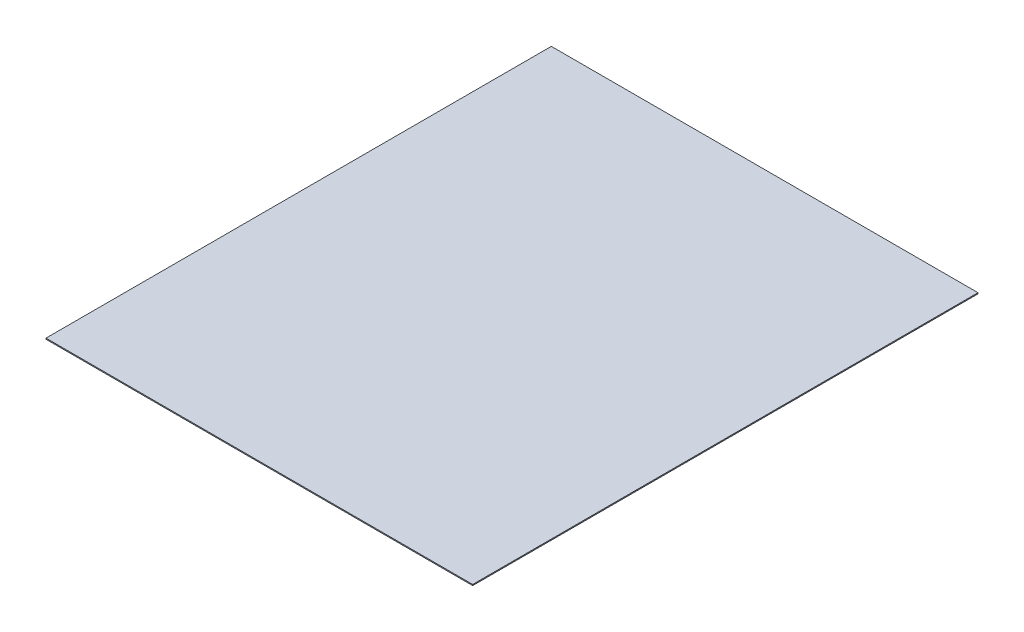
ISO-10303-21;
HEADER;
FILE_DESCRIPTION(('STEP AP214'),'2;1');
FILE_NAME('part.step','',(''),(''),'','','');
FILE_SCHEMA(('AUTOMOTIVE_DESIGN { 1 0 10303 214 1 1 1 1 }'));
ENDSEC;
DATA;
#1=APPLICATION_CONTEXT('core data for automotive mechanical design processes');
#2=APPLICATION_PROTOCOL_DEFINITION('international standard','automotive_design',2000,#1);
#3=PRODUCT_CONTEXT('',#1,'mechanical');
#4=PRODUCT('Part','Part','',(#3));
#5=PRODUCT_RELATED_PRODUCT_CATEGORY('part','',(#4));
#6=PRODUCT_DEFINITION_FORMATION('','',#4);
#7=PRODUCT_DEFINITION_CONTEXT('part definition',#1,'design');
#8=PRODUCT_DEFINITION('design','',#6,#7);
#9=PRODUCT_DEFINITION_SHAPE('','',#8);
#10=(LENGTH_UNIT() NAMED_UNIT(*) SI_UNIT(.MILLI.,.METRE.));
#11=(NAMED_UNIT(*) PLANE_ANGLE_UNIT() SI_UNIT($,.RADIAN.));
#12=(NAMED_UNIT(*) SI_UNIT($,.STERADIAN.) SOLID_ANGLE_UNIT());
#13=UNCERTAINTY_MEASURE_WITH_UNIT(LENGTH_MEASURE(1.E-05),#10,'distance_accuracy_value','');
#14=(GEOMETRIC_REPRESENTATION_CONTEXT(3) GLOBAL_UNCERTAINTY_ASSIGNED_CONTEXT((#13)) GLOBAL_UNIT_ASSIGNED_CONTEXT((#10,
#11,#12)) REPRESENTATION_CONTEXT('',''));
#15=CARTESIAN_POINT('',(0.,0.,0.));
#16=DIRECTION('',(0.,0.,1.));
#17=DIRECTION('',(1.,0.,0.));
#18=AXIS2_PLACEMENT_3D('',#15,#16,#17);
#19=CARTESIAN_POINT('',(0.,270.,0.));
#20=DIRECTION('',(0.,1.,0.));
#21=DIRECTION('',(0.,0.,1.));
#22=AXIS2_PLACEMENT_3D('',#19,#20,#21);
#23=PLANE('',#22);
#24=DIRECTION('',(1.,0.,0.));
#25=VECTOR('',#24,1.);
#26=CARTESIAN_POINT('',(640.,270.,-30.));
#27=LINE('',#26,#25);
#28=CARTESIAN_POINT('',(23.5999999999996,270.,-30.));
#29=VERTEX_POINT('',#28);
#30=CARTESIAN_POINT('',(640.,270.,-30.));
#31=VERTEX_POINT('',#30);
#32=EDGE_CURVE('E78',#29,#31,#27,.T.);
#33=ORIENTED_EDGE('',*,*,#32,.F.);
#34=DIRECTION('',(0.,0.,1.));
#35=VECTOR('',#34,1.);
#36=CARTESIAN_POINT('',(23.5999999999996,270.,-30.));
#37=LINE('',#36,#35);
#38=CARTESIAN_POINT('',(23.5999999999996,270.,-760.));
#39=VERTEX_POINT('',#38);
#40=EDGE_CURVE('E54',#39,#29,#37,.T.);
#41=ORIENTED_EDGE('',*,*,#40,.F.);
#42=DIRECTION('',(1.,0.,0.));
#43=VECTOR('',#42,1.);
#44=CARTESIAN_POINT('',(640.,270.,-760.));
#45=LINE('',#44,#43);
#46=CARTESIAN_POINT('',(640.,270.,-760.));
#47=VERTEX_POINT('',#46);
#48=EDGE_CURVE('E56',#47,#39,#45,.F.);
#49=ORIENTED_EDGE('',*,*,#48,.F.);
#50=DIRECTION('',(0.,0.,-1.));
#51=VECTOR('',#50,1.);
#52=CARTESIAN_POINT('',(640.,270.,-30.));
#53=LINE('',#52,#51);
#54=EDGE_CURVE('E19',#31,#47,#53,.T.);
#55=ORIENTED_EDGE('',*,*,#54,.F.);
#56=EDGE_LOOP('',(#33,#41,#49,#55));
#57=FACE_BOUND('',#56,.T.);
#58=ADVANCED_FACE('F16',(#57),#23,.F.);
#59=CARTESIAN_POINT('',(640.,271.5,-30.));
#60=DIRECTION('',(1.,0.,0.));
#61=DIRECTION('',(0.,0.,-1.));
#62=AXIS2_PLACEMENT_3D('',#59,#60,#61);
#63=PLANE('',#62);
#64=DIRECTION('',(0.,0.,1.));
#65=VECTOR('',#64,1.);
#66=CARTESIAN_POINT('',(640.,271.5,0.));
#67=LINE('',#66,#65);
#68=CARTESIAN_POINT('',(640.,271.5,-30.));
#69=VERTEX_POINT('',#68);
#70=CARTESIAN_POINT('',(640.,271.5,-760.));
#71=VERTEX_POINT('',#70);
#72=EDGE_CURVE('E82',#69,#71,#67,.F.);
#73=ORIENTED_EDGE('',*,*,#72,.F.);
#74=DIRECTION('',(0.,-1.,0.));
#75=VECTOR('',#74,1.);
#76=CARTESIAN_POINT('',(640.,271.5,-30.));
#77=LINE('',#76,#75);
#78=EDGE_CURVE('E67',#31,#69,#77,.F.);
#79=ORIENTED_EDGE('',*,*,#78,.F.);
#80=ORIENTED_EDGE('',*,*,#54,.T.);
#81=DIRECTION('',(0.,1.,0.));
#82=VECTOR('',#81,1.);
#83=CARTESIAN_POINT('',(640.,271.5,-760.));
#84=LINE('',#83,#82);
#85=EDGE_CURVE('E62',#71,#47,#84,.F.);
#86=ORIENTED_EDGE('',*,*,#85,.F.);
#87=EDGE_LOOP('',(#73,#79,#80,#86));
#88=FACE_BOUND('',#87,.T.);
#89=ADVANCED_FACE('F64',(#88),#63,.T.);
#90=CARTESIAN_POINT('',(640.,271.5,-760.));
#91=DIRECTION('',(0.,0.,-1.));
#92=DIRECTION('',(0.,1.,0.));
#93=AXIS2_PLACEMENT_3D('',#90,#91,#92);
#94=PLANE('',#93);
#95=DIRECTION('',(1.,0.,0.));
#96=VECTOR('',#95,1.);
#97=CARTESIAN_POINT('',(0.,271.5,-760.));
#98=LINE('',#97,#96);
#99=CARTESIAN_POINT('',(23.5999999999996,271.5,-760.));
#100=VERTEX_POINT('',#99);
#101=EDGE_CURVE('E71',#71,#100,#98,.F.);
#102=ORIENTED_EDGE('',*,*,#101,.F.);
#103=ORIENTED_EDGE('',*,*,#85,.T.);
#104=ORIENTED_EDGE('',*,*,#48,.T.);
#105=DIRECTION('',(0.,1.,0.));
#106=VECTOR('',#105,1.);
#107=CARTESIAN_POINT('',(23.5999999999996,271.5,-760.));
#108=LINE('',#107,#106);
#109=EDGE_CURVE('E74',#100,#39,#108,.F.);
#110=ORIENTED_EDGE('',*,*,#109,.F.);
#111=EDGE_LOOP('',(#102,#103,#104,#110));
#112=FACE_BOUND('',#111,.T.);
#113=ADVANCED_FACE('F69',(#112),#94,.T.);
#114=CARTESIAN_POINT('',(23.5999999999996,271.5,-30.));
#115=DIRECTION('',(-1.,0.,0.));
#116=DIRECTION('',(0.,0.,1.));
#117=AXIS2_PLACEMENT_3D('',#114,#115,#116);
#118=PLANE('',#117);
#119=DIRECTION('',(0.,0.,1.));
#120=VECTOR('',#119,1.);
#121=CARTESIAN_POINT('',(23.5999999999996,271.5,0.));
#122=LINE('',#121,#120);
#123=CARTESIAN_POINT('',(23.5999999999996,271.5,-30.));
#124=VERTEX_POINT('',#123);
#125=EDGE_CURVE('E25',#100,#124,#122,.T.);
#126=ORIENTED_EDGE('',*,*,#125,.F.);
#127=ORIENTED_EDGE('',*,*,#109,.T.);
#128=ORIENTED_EDGE('',*,*,#40,.T.);
#129=DIRECTION('',(0.,-1.,0.));
#130=VECTOR('',#129,1.);
#131=CARTESIAN_POINT('',(23.5999999999996,271.5,-30.));
#132=LINE('',#131,#130);
#133=EDGE_CURVE('E34',#124,#29,#132,.T.);
#134=ORIENTED_EDGE('',*,*,#133,.F.);
#135=EDGE_LOOP('',(#126,#127,#128,#134));
#136=FACE_BOUND('',#135,.T.);
#137=ADVANCED_FACE('F88',(#136),#118,.T.);
#138=CARTESIAN_POINT('',(640.,271.5,-30.));
#139=DIRECTION('',(0.,0.,1.));
#140=DIRECTION('',(0.,-1.,0.));
#141=AXIS2_PLACEMENT_3D('',#138,#139,#140);
#142=PLANE('',#141);
#143=DIRECTION('',(1.,0.,0.));
#144=VECTOR('',#143,1.);
#145=CARTESIAN_POINT('',(0.,271.5,-30.));
#146=LINE('',#145,#144);
#147=EDGE_CURVE('E11',#124,#69,#146,.T.);
#148=ORIENTED_EDGE('',*,*,#147,.F.);
#149=ORIENTED_EDGE('',*,*,#133,.T.);
#150=ORIENTED_EDGE('',*,*,#32,.T.);
#151=ORIENTED_EDGE('',*,*,#78,.T.);
#152=EDGE_LOOP('',(#148,#149,#150,#151));
#153=FACE_BOUND('',#152,.T.);
#154=ADVANCED_FACE('F90',(#153),#142,.T.);
#155=CARTESIAN_POINT('',(0.,271.5,0.));
#156=DIRECTION('',(0.,1.,0.));
#157=DIRECTION('',(0.,0.,1.));
#158=AXIS2_PLACEMENT_3D('',#155,#156,#157);
#159=PLANE('',#158);
#160=ORIENTED_EDGE('',*,*,#125,.T.);
#161=ORIENTED_EDGE('',*,*,#147,.T.);
#162=ORIENTED_EDGE('',*,*,#72,.T.);
#163=ORIENTED_EDGE('',*,*,#101,.T.);
#164=EDGE_LOOP('',(#160,#161,#162,#163));
#165=FACE_BOUND('',#164,.T.);
#166=ADVANCED_FACE('F87',(#165),#159,.T.);
#167=CLOSED_SHELL('',(#58,#89,#113,#137,#154,#166));
#168=MANIFOLD_SOLID_BREP('B1',#167);
#169=ADVANCED_BREP_SHAPE_REPRESENTATION('',(#18,#168),#14);
#170=SHAPE_DEFINITION_REPRESENTATION(#9,#169);
ENDSEC;
END-ISO-10303-21;
